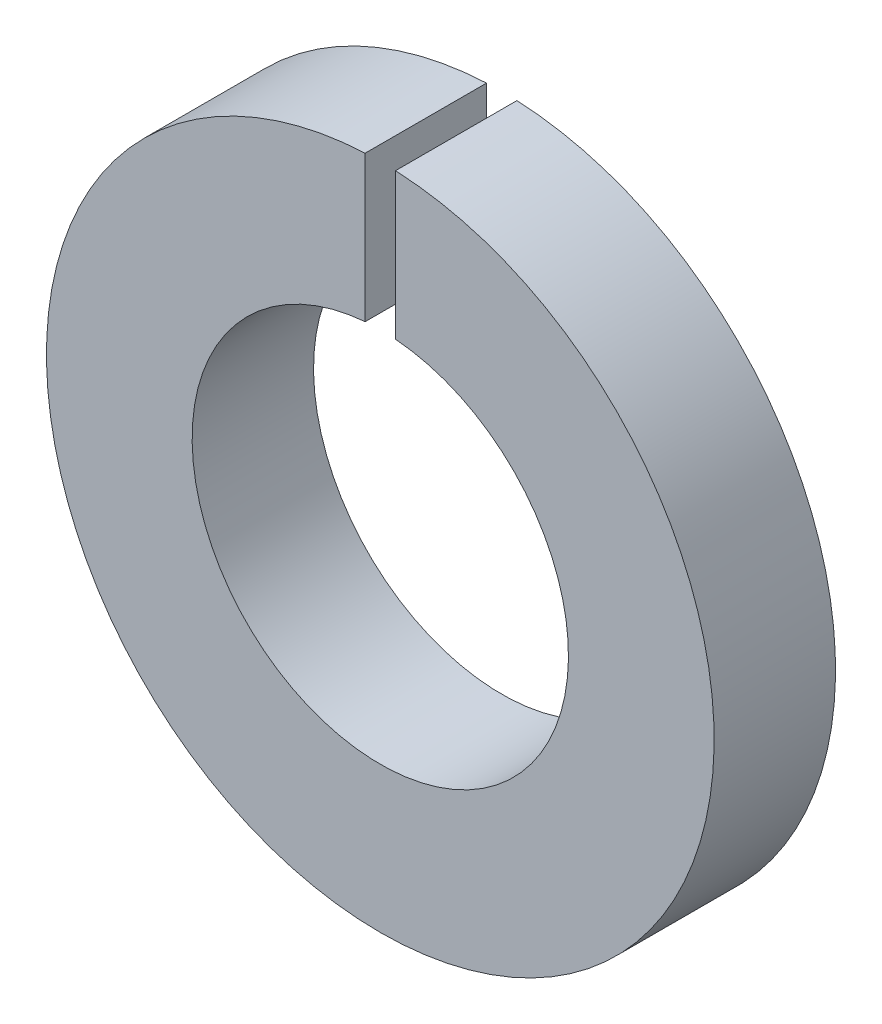
ISO-10303-21;
HEADER;
FILE_DESCRIPTION(('STEP AP214'),'2;1');
FILE_NAME('part.step','',(''),(''),'','','');
FILE_SCHEMA(('AUTOMOTIVE_DESIGN { 1 0 10303 214 1 1 1 1 }'));
ENDSEC;
DATA;
#1=APPLICATION_CONTEXT('core data for automotive mechanical design processes');
#2=APPLICATION_PROTOCOL_DEFINITION('international standard','automotive_design',2000,#1);
#3=PRODUCT_CONTEXT('',#1,'mechanical');
#4=PRODUCT('Part','Part','',(#3));
#5=PRODUCT_RELATED_PRODUCT_CATEGORY('part','',(#4));
#6=PRODUCT_DEFINITION_FORMATION('','',#4);
#7=PRODUCT_DEFINITION_CONTEXT('part definition',#1,'design');
#8=PRODUCT_DEFINITION('design','',#6,#7);
#9=PRODUCT_DEFINITION_SHAPE('','',#8);
#10=(LENGTH_UNIT() NAMED_UNIT(*) SI_UNIT(.MILLI.,.METRE.));
#11=(NAMED_UNIT(*) PLANE_ANGLE_UNIT() SI_UNIT($,.RADIAN.));
#12=(NAMED_UNIT(*) SI_UNIT($,.STERADIAN.) SOLID_ANGLE_UNIT());
#13=UNCERTAINTY_MEASURE_WITH_UNIT(LENGTH_MEASURE(1.E-05),#10,'distance_accuracy_value','');
#14=(GEOMETRIC_REPRESENTATION_CONTEXT(3) GLOBAL_UNCERTAINTY_ASSIGNED_CONTEXT((#13)) GLOBAL_UNIT_ASSIGNED_CONTEXT((#10,
#11,#12)) REPRESENTATION_CONTEXT('',''));
#15=CARTESIAN_POINT('',(0.,0.,0.));
#16=DIRECTION('',(0.,0.,1.));
#17=DIRECTION('',(1.,0.,0.));
#18=AXIS2_PLACEMENT_3D('',#15,#16,#17);
#19=CARTESIAN_POINT('',(0.,0.,0.));
#20=DIRECTION('',(0.,0.,1.));
#21=DIRECTION('',(1.,0.,0.));
#22=AXIS2_PLACEMENT_3D('',#19,#20,#21);
#23=PLANE('',#22);
#24=CARTESIAN_POINT('',(0.,0.,0.));
#25=DIRECTION('',(0.,0.,-1.));
#26=DIRECTION('',(-1.,0.,0.));
#27=AXIS2_PLACEMENT_3D('',#24,#25,#26);
#28=CIRCLE('',#27,2.75);
#29=CARTESIAN_POINT('',(-0.125,2.74715762197949,0.));
#30=VERTEX_POINT('',#29);
#31=CARTESIAN_POINT('',(0.125,2.74715762197949,0.));
#32=VERTEX_POINT('',#31);
#33=EDGE_CURVE('E20',#30,#32,#28,.F.);
#34=ORIENTED_EDGE('',*,*,#33,.F.);
#35=DIRECTION('',(0.,1.,0.));
#36=VECTOR('',#35,1.);
#37=CARTESIAN_POINT('',(-0.125,0.,0.));
#38=LINE('',#37,#36);
#39=CARTESIAN_POINT('',(-0.125,1.54495145554804,0.));
#40=VERTEX_POINT('',#39);
#41=EDGE_CURVE('E71',#40,#30,#38,.T.);
#42=ORIENTED_EDGE('',*,*,#41,.F.);
#43=CARTESIAN_POINT('',(0.,0.,0.));
#44=DIRECTION('',(0.,0.,-1.));
#45=DIRECTION('',(-1.,0.,0.));
#46=AXIS2_PLACEMENT_3D('',#43,#44,#45);
#47=CIRCLE('',#46,1.55);
#48=CARTESIAN_POINT('',(0.125,1.54495145554804,0.));
#49=VERTEX_POINT('',#48);
#50=EDGE_CURVE('E58',#40,#49,#47,.F.);
#51=ORIENTED_EDGE('',*,*,#50,.T.);
#52=DIRECTION('',(0.,1.,0.));
#53=VECTOR('',#52,1.);
#54=CARTESIAN_POINT('',(0.125,1.54495145554804,0.));
#55=LINE('',#54,#53);
#56=EDGE_CURVE('E54',#32,#49,#55,.F.);
#57=ORIENTED_EDGE('',*,*,#56,.F.);
#58=EDGE_LOOP('',(#34,#42,#51,#57));
#59=FACE_BOUND('',#58,.T.);
#60=ADVANCED_FACE('F17',(#59),#23,.F.);
#61=CARTESIAN_POINT('',(0.,0.,1.));
#62=DIRECTION('',(0.,0.,-1.));
#63=DIRECTION('',(-1.,0.,0.));
#64=AXIS2_PLACEMENT_3D('',#61,#62,#63);
#65=CYLINDRICAL_SURFACE('',#64,2.75);
#66=ORIENTED_EDGE('',*,*,#33,.T.);
#67=DIRECTION('',(0.,0.,1.));
#68=VECTOR('',#67,1.);
#69=CARTESIAN_POINT('',(0.125,2.74715762197949,1.));
#70=LINE('',#69,#68);
#71=CARTESIAN_POINT('',(0.125,2.74715762197949,1.));
#72=VERTEX_POINT('',#71);
#73=EDGE_CURVE('E62',#72,#32,#70,.F.);
#74=ORIENTED_EDGE('',*,*,#73,.F.);
#75=CARTESIAN_POINT('',(0.,0.,1.));
#76=DIRECTION('',(0.,0.,-1.));
#77=DIRECTION('',(-1.,0.,0.));
#78=AXIS2_PLACEMENT_3D('',#75,#76,#77);
#79=CIRCLE('',#78,2.75);
#80=CARTESIAN_POINT('',(-0.125,2.74715762197949,1.));
#81=VERTEX_POINT('',#80);
#82=EDGE_CURVE('E81',#81,#72,#79,.F.);
#83=ORIENTED_EDGE('',*,*,#82,.F.);
#84=DIRECTION('',(0.,0.,-1.));
#85=VECTOR('',#84,1.);
#86=CARTESIAN_POINT('',(-0.125,2.74715762197949,1.));
#87=LINE('',#86,#85);
#88=EDGE_CURVE('E70',#30,#81,#87,.F.);
#89=ORIENTED_EDGE('',*,*,#88,.F.);
#90=EDGE_LOOP('',(#66,#74,#83,#89));
#91=FACE_BOUND('',#90,.T.);
#92=ADVANCED_FACE('F67',(#91),#65,.T.);
#93=CARTESIAN_POINT('',(0.125,1.54495145554804,1.));
#94=DIRECTION('',(-1.,0.,0.));
#95=DIRECTION('',(0.,0.,1.));
#96=AXIS2_PLACEMENT_3D('',#93,#94,#95);
#97=PLANE('',#96);
#98=DIRECTION('',(0.,1.,0.));
#99=VECTOR('',#98,1.);
#100=CARTESIAN_POINT('',(0.125,0.,1.));
#101=LINE('',#100,#99);
#102=CARTESIAN_POINT('',(0.125,1.54495145554804,1.));
#103=VERTEX_POINT('',#102);
#104=EDGE_CURVE('E73',#72,#103,#101,.F.);
#105=ORIENTED_EDGE('',*,*,#104,.F.);
#106=ORIENTED_EDGE('',*,*,#73,.T.);
#107=ORIENTED_EDGE('',*,*,#56,.T.);
#108=DIRECTION('',(0.,0.,-1.));
#109=VECTOR('',#108,1.);
#110=CARTESIAN_POINT('',(0.125,1.54495145554804,1.));
#111=LINE('',#110,#109);
#112=EDGE_CURVE('E74',#49,#103,#111,.F.);
#113=ORIENTED_EDGE('',*,*,#112,.T.);
#114=EDGE_LOOP('',(#105,#106,#107,#113));
#115=FACE_BOUND('',#114,.T.);
#116=ADVANCED_FACE('F72',(#115),#97,.T.);
#117=CARTESIAN_POINT('',(0.,0.,1.));
#118=DIRECTION('',(0.,0.,-1.));
#119=DIRECTION('',(-1.,0.,0.));
#120=AXIS2_PLACEMENT_3D('',#117,#118,#119);
#121=CYLINDRICAL_SURFACE('',#120,1.55);
#122=DIRECTION('',(0.,0.,-1.));
#123=VECTOR('',#122,1.);
#124=CARTESIAN_POINT('',(-0.125,1.54495145554804,1.));
#125=LINE('',#124,#123);
#126=CARTESIAN_POINT('',(-0.125,1.54495145554804,1.));
#127=VERTEX_POINT('',#126);
#128=EDGE_CURVE('E82',#127,#40,#125,.T.);
#129=ORIENTED_EDGE('',*,*,#128,.F.);
#130=CARTESIAN_POINT('',(0.,0.,1.));
#131=DIRECTION('',(0.,0.,-1.));
#132=DIRECTION('',(-1.,0.,0.));
#133=AXIS2_PLACEMENT_3D('',#130,#131,#132);
#134=CIRCLE('',#133,1.55);
#135=EDGE_CURVE('E26',#103,#127,#134,.T.);
#136=ORIENTED_EDGE('',*,*,#135,.F.);
#137=ORIENTED_EDGE('',*,*,#112,.F.);
#138=ORIENTED_EDGE('',*,*,#50,.F.);
#139=EDGE_LOOP('',(#129,#136,#137,#138));
#140=FACE_BOUND('',#139,.T.);
#141=ADVANCED_FACE('F91',(#140),#121,.F.);
#142=CARTESIAN_POINT('',(-0.125,1.54495145554804,1.));
#143=DIRECTION('',(1.,0.,0.));
#144=DIRECTION('',(0.,0.,-1.));
#145=AXIS2_PLACEMENT_3D('',#142,#143,#144);
#146=PLANE('',#145);
#147=DIRECTION('',(0.,1.,0.));
#148=VECTOR('',#147,1.);
#149=CARTESIAN_POINT('',(-0.125,0.,1.));
#150=LINE('',#149,#148);
#151=EDGE_CURVE('E11',#127,#81,#150,.T.);
#152=ORIENTED_EDGE('',*,*,#151,.F.);
#153=ORIENTED_EDGE('',*,*,#128,.T.);
#154=ORIENTED_EDGE('',*,*,#41,.T.);
#155=ORIENTED_EDGE('',*,*,#88,.T.);
#156=EDGE_LOOP('',(#152,#153,#154,#155));
#157=FACE_BOUND('',#156,.T.);
#158=ADVANCED_FACE('F89',(#157),#146,.T.);
#159=CARTESIAN_POINT('',(0.,0.,1.));
#160=DIRECTION('',(0.,0.,1.));
#161=DIRECTION('',(1.,0.,0.));
#162=AXIS2_PLACEMENT_3D('',#159,#160,#161);
#163=PLANE('',#162);
#164=ORIENTED_EDGE('',*,*,#135,.T.);
#165=ORIENTED_EDGE('',*,*,#151,.T.);
#166=ORIENTED_EDGE('',*,*,#82,.T.);
#167=ORIENTED_EDGE('',*,*,#104,.T.);
#168=EDGE_LOOP('',(#164,#165,#166,#167));
#169=FACE_BOUND('',#168,.T.);
#170=ADVANCED_FACE('F88',(#169),#163,.T.);
#171=CLOSED_SHELL('',(#60,#92,#116,#141,#158,#170));
#172=MANIFOLD_SOLID_BREP('B1',#171);
#173=ADVANCED_BREP_SHAPE_REPRESENTATION('',(#18,#172),#14);
#174=SHAPE_DEFINITION_REPRESENTATION(#9,#173);
ENDSEC;
END-ISO-10303-21;
